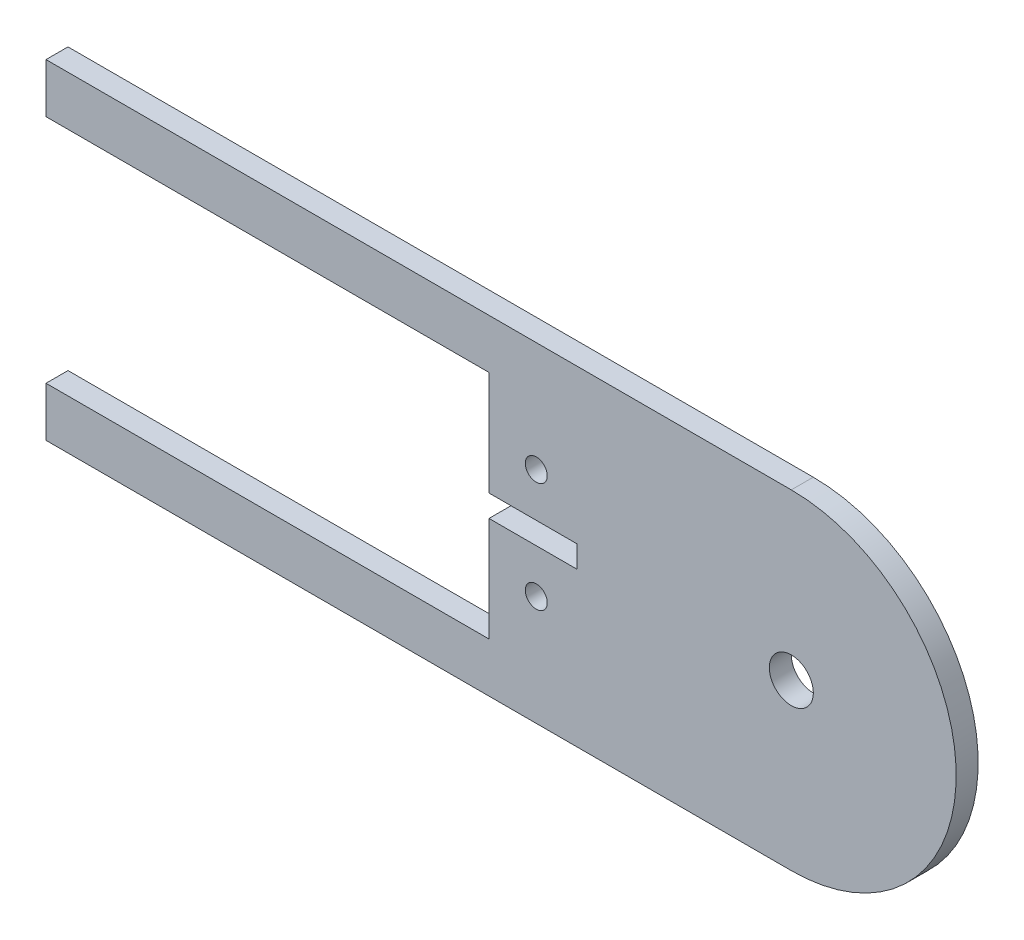
ISO-10303-21;
HEADER;
FILE_DESCRIPTION(('STEP AP214'),'2;1');
FILE_NAME('part.step','',(''),(''),'','','');
FILE_SCHEMA(('AUTOMOTIVE_DESIGN { 1 0 10303 214 1 1 1 1 }'));
ENDSEC;
DATA;
#1=APPLICATION_CONTEXT('core data for automotive mechanical design processes');
#2=APPLICATION_PROTOCOL_DEFINITION('international standard','automotive_design',2000,#1);
#3=PRODUCT_CONTEXT('',#1,'mechanical');
#4=PRODUCT('Part','Part','',(#3));
#5=PRODUCT_RELATED_PRODUCT_CATEGORY('part','',(#4));
#6=PRODUCT_DEFINITION_FORMATION('','',#4);
#7=PRODUCT_DEFINITION_CONTEXT('part definition',#1,'design');
#8=PRODUCT_DEFINITION('design','',#6,#7);
#9=PRODUCT_DEFINITION_SHAPE('','',#8);
#10=(LENGTH_UNIT() NAMED_UNIT(*) SI_UNIT(.MILLI.,.METRE.));
#11=(NAMED_UNIT(*) PLANE_ANGLE_UNIT() SI_UNIT($,.RADIAN.));
#12=(NAMED_UNIT(*) SI_UNIT($,.STERADIAN.) SOLID_ANGLE_UNIT());
#13=UNCERTAINTY_MEASURE_WITH_UNIT(LENGTH_MEASURE(1.E-05),#10,'distance_accuracy_value','');
#14=(GEOMETRIC_REPRESENTATION_CONTEXT(3) GLOBAL_UNCERTAINTY_ASSIGNED_CONTEXT((#13)) GLOBAL_UNIT_ASSIGNED_CONTEXT((#10,
#11,#12)) REPRESENTATION_CONTEXT('',''));
#15=CARTESIAN_POINT('',(0.,0.,0.));
#16=DIRECTION('',(0.,0.,1.));
#17=DIRECTION('',(1.,0.,0.));
#18=AXIS2_PLACEMENT_3D('',#15,#16,#17);
#19=CARTESIAN_POINT('',(0.,30.,-33.));
#20=DIRECTION('',(0.,0.,1.));
#21=DIRECTION('',(1.,0.,0.));
#22=AXIS2_PLACEMENT_3D('',#19,#20,#21);
#23=PLANE('',#22);
#24=CARTESIAN_POINT('',(77.8,15.,-33.));
#25=DIRECTION('',(0.,0.,1.));
#26=DIRECTION('',(1.,0.,0.));
#27=AXIS2_PLACEMENT_3D('',#24,#25,#26);
#28=CIRCLE('',#27,2.);
#29=CARTESIAN_POINT('',(79.8,15.,-33.));
#30=VERTEX_POINT('',#29);
#31=EDGE_CURVE('E181',#30,#30,#28,.T.);
#32=ORIENTED_EDGE('',*,*,#31,.T.);
#33=EDGE_LOOP('',(#32));
#34=FACE_BOUND('',#33,.T.);
#35=CARTESIAN_POINT('',(54.6,9.99999999999999,-33.));
#36=DIRECTION('',(0.,0.,-1.));
#37=DIRECTION('',(-1.,0.,0.));
#38=AXIS2_PLACEMENT_3D('',#35,#36,#37);
#39=CIRCLE('',#38,1.00000000000001);
#40=CARTESIAN_POINT('',(53.6,9.99999999999999,-33.));
#41=VERTEX_POINT('',#40);
#42=EDGE_CURVE('E176',#41,#41,#39,.T.);
#43=ORIENTED_EDGE('',*,*,#42,.F.);
#44=EDGE_LOOP('',(#43));
#45=FACE_BOUND('',#44,.T.);
#46=CARTESIAN_POINT('',(54.6,20.,-33.));
#47=DIRECTION('',(0.,0.,-1.));
#48=DIRECTION('',(-1.,0.,0.));
#49=AXIS2_PLACEMENT_3D('',#46,#47,#48);
#50=CIRCLE('',#49,0.999999999999998);
#51=CARTESIAN_POINT('',(53.6,20.,-33.));
#52=VERTEX_POINT('',#51);
#53=EDGE_CURVE('E255',#52,#52,#50,.T.);
#54=ORIENTED_EDGE('',*,*,#53,.F.);
#55=EDGE_LOOP('',(#54));
#56=FACE_BOUND('',#55,.T.);
#57=DIRECTION('',(-1.,0.,0.));
#58=VECTOR('',#57,1.);
#59=CARTESIAN_POINT('',(0.,30.,-33.));
#60=LINE('',#59,#58);
#61=CARTESIAN_POINT('',(77.8,30.,-33.));
#62=VERTEX_POINT('',#61);
#63=CARTESIAN_POINT('',(9.99999999999999,30.,-33.));
#64=VERTEX_POINT('',#63);
#65=EDGE_CURVE('E148',#62,#64,#60,.T.);
#66=ORIENTED_EDGE('',*,*,#65,.F.);
#67=CARTESIAN_POINT('',(77.8,15.,-33.));
#68=DIRECTION('',(0.,0.,1.));
#69=DIRECTION('',(-1.,0.,0.));
#70=AXIS2_PLACEMENT_3D('',#67,#68,#69);
#71=CIRCLE('',#70,15.);
#72=CARTESIAN_POINT('',(77.8,0.,-33.));
#73=VERTEX_POINT('',#72);
#74=EDGE_CURVE('E128',#73,#62,#71,.T.);
#75=ORIENTED_EDGE('',*,*,#74,.F.);
#76=DIRECTION('',(-1.,0.,0.));
#77=VECTOR('',#76,1.);
#78=CARTESIAN_POINT('',(0.,0.,-33.));
#79=LINE('',#78,#77);
#80=CARTESIAN_POINT('',(9.99999999999999,0.,-33.));
#81=VERTEX_POINT('',#80);
#82=EDGE_CURVE('E155',#73,#81,#79,.T.);
#83=ORIENTED_EDGE('',*,*,#82,.T.);
#84=DIRECTION('',(0.,-1.,0.));
#85=VECTOR('',#84,1.);
#86=CARTESIAN_POINT('',(9.99999999999999,30.,-33.));
#87=LINE('',#86,#85);
#88=CARTESIAN_POINT('',(10.,4.5,-33.));
#89=VERTEX_POINT('',#88);
#90=EDGE_CURVE('E46',#89,#81,#87,.T.);
#91=ORIENTED_EDGE('',*,*,#90,.F.);
#92=DIRECTION('',(1.,0.,0.));
#93=VECTOR('',#92,1.);
#94=CARTESIAN_POINT('',(0.,4.5,-33.));
#95=LINE('',#94,#93);
#96=CARTESIAN_POINT('',(50.3,4.5,-33.));
#97=VERTEX_POINT('',#96);
#98=EDGE_CURVE('E157',#89,#97,#95,.T.);
#99=ORIENTED_EDGE('',*,*,#98,.T.);
#100=DIRECTION('',(0.,1.,0.));
#101=VECTOR('',#100,1.);
#102=CARTESIAN_POINT('',(50.3,30.,-33.));
#103=LINE('',#102,#101);
#104=CARTESIAN_POINT('',(50.3,14.,-33.));
#105=VERTEX_POINT('',#104);
#106=EDGE_CURVE('E202',#97,#105,#103,.T.);
#107=ORIENTED_EDGE('',*,*,#106,.T.);
#108=DIRECTION('',(1.,0.,0.));
#109=VECTOR('',#108,1.);
#110=CARTESIAN_POINT('',(0.,14.,-33.));
#111=LINE('',#110,#109);
#112=CARTESIAN_POINT('',(58.3,14.,-33.));
#113=VERTEX_POINT('',#112);
#114=EDGE_CURVE('E225',#105,#113,#111,.T.);
#115=ORIENTED_EDGE('',*,*,#114,.T.);
#116=DIRECTION('',(0.,1.,0.));
#117=VECTOR('',#116,1.);
#118=CARTESIAN_POINT('',(58.3,30.,-33.));
#119=LINE('',#118,#117);
#120=CARTESIAN_POINT('',(58.3,16.,-33.));
#121=VERTEX_POINT('',#120);
#122=EDGE_CURVE('E228',#113,#121,#119,.T.);
#123=ORIENTED_EDGE('',*,*,#122,.T.);
#124=DIRECTION('',(-1.,0.,0.));
#125=VECTOR('',#124,1.);
#126=CARTESIAN_POINT('',(0.,16.,-33.));
#127=LINE('',#126,#125);
#128=CARTESIAN_POINT('',(50.3,16.,-33.));
#129=VERTEX_POINT('',#128);
#130=EDGE_CURVE('E226',#121,#129,#127,.T.);
#131=ORIENTED_EDGE('',*,*,#130,.T.);
#132=CARTESIAN_POINT('',(50.3,25.5,-33.));
#133=VERTEX_POINT('',#132);
#134=EDGE_CURVE('E197',#129,#133,#103,.T.);
#135=ORIENTED_EDGE('',*,*,#134,.T.);
#136=DIRECTION('',(-1.,0.,0.));
#137=VECTOR('',#136,1.);
#138=CARTESIAN_POINT('',(0.,25.5,-33.));
#139=LINE('',#138,#137);
#140=CARTESIAN_POINT('',(9.99999999999999,25.5,-33.));
#141=VERTEX_POINT('',#140);
#142=EDGE_CURVE('E194',#133,#141,#139,.T.);
#143=ORIENTED_EDGE('',*,*,#142,.T.);
#144=EDGE_CURVE('E161',#64,#141,#87,.T.);
#145=ORIENTED_EDGE('',*,*,#144,.F.);
#146=EDGE_LOOP('',(#66,#75,#83,#91,#99,#107,#115,#123,#131,#135,#143,#145));
#147=FACE_BOUND('',#146,.T.);
#148=ADVANCED_FACE('F37',(#34,#45,#56,#147),#23,.F.);
#149=CARTESIAN_POINT('',(0.,30.,-31.));
#150=DIRECTION('',(0.,0.,-1.));
#151=DIRECTION('',(-1.,0.,0.));
#152=AXIS2_PLACEMENT_3D('',#149,#150,#151);
#153=PLANE('',#152);
#154=CARTESIAN_POINT('',(77.8,15.,-31.));
#155=DIRECTION('',(0.,0.,-1.));
#156=DIRECTION('',(-1.,0.,0.));
#157=AXIS2_PLACEMENT_3D('',#154,#155,#156);
#158=CIRCLE('',#157,2.);
#159=CARTESIAN_POINT('',(75.8,15.,-31.));
#160=VERTEX_POINT('',#159);
#161=EDGE_CURVE('E132',#160,#160,#158,.T.);
#162=ORIENTED_EDGE('',*,*,#161,.T.);
#163=EDGE_LOOP('',(#162));
#164=FACE_BOUND('',#163,.T.);
#165=CARTESIAN_POINT('',(54.6,9.99999999999999,-31.));
#166=DIRECTION('',(0.,0.,-1.));
#167=DIRECTION('',(-1.,0.,0.));
#168=AXIS2_PLACEMENT_3D('',#165,#166,#167);
#169=CIRCLE('',#168,1.00000000000001);
#170=CARTESIAN_POINT('',(53.6,9.99999999999999,-31.));
#171=VERTEX_POINT('',#170);
#172=EDGE_CURVE('E175',#171,#171,#169,.T.);
#173=ORIENTED_EDGE('',*,*,#172,.T.);
#174=EDGE_LOOP('',(#173));
#175=FACE_BOUND('',#174,.T.);
#176=CARTESIAN_POINT('',(54.6,20.,-31.));
#177=DIRECTION('',(0.,0.,-1.));
#178=DIRECTION('',(-1.,0.,0.));
#179=AXIS2_PLACEMENT_3D('',#176,#177,#178);
#180=CIRCLE('',#179,0.999999999999998);
#181=CARTESIAN_POINT('',(53.6,20.,-31.));
#182=VERTEX_POINT('',#181);
#183=EDGE_CURVE('E172',#182,#182,#180,.T.);
#184=ORIENTED_EDGE('',*,*,#183,.T.);
#185=EDGE_LOOP('',(#184));
#186=FACE_BOUND('',#185,.T.);
#187=DIRECTION('',(1.,0.,0.));
#188=VECTOR('',#187,1.);
#189=CARTESIAN_POINT('',(0.,0.,-31.));
#190=LINE('',#189,#188);
#191=CARTESIAN_POINT('',(10.,0.,-31.));
#192=VERTEX_POINT('',#191);
#193=CARTESIAN_POINT('',(77.8,0.,-31.));
#194=VERTEX_POINT('',#193);
#195=EDGE_CURVE('E142',#192,#194,#190,.T.);
#196=ORIENTED_EDGE('',*,*,#195,.T.);
#197=CARTESIAN_POINT('',(77.8,15.,-31.));
#198=DIRECTION('',(0.,0.,1.));
#199=DIRECTION('',(-1.,0.,0.));
#200=AXIS2_PLACEMENT_3D('',#197,#198,#199);
#201=CIRCLE('',#200,15.);
#202=CARTESIAN_POINT('',(77.8,30.,-31.));
#203=VERTEX_POINT('',#202);
#204=EDGE_CURVE('E54',#194,#203,#201,.T.);
#205=ORIENTED_EDGE('',*,*,#204,.T.);
#206=DIRECTION('',(1.,0.,0.));
#207=VECTOR('',#206,1.);
#208=CARTESIAN_POINT('',(0.,30.,-31.));
#209=LINE('',#208,#207);
#210=CARTESIAN_POINT('',(10.,30.,-31.));
#211=VERTEX_POINT('',#210);
#212=EDGE_CURVE('E139',#211,#203,#209,.T.);
#213=ORIENTED_EDGE('',*,*,#212,.F.);
#214=DIRECTION('',(0.,-1.,0.));
#215=VECTOR('',#214,1.);
#216=CARTESIAN_POINT('',(10.,30.,-31.));
#217=LINE('',#216,#215);
#218=CARTESIAN_POINT('',(10.,25.5,-31.));
#219=VERTEX_POINT('',#218);
#220=EDGE_CURVE('E150',#211,#219,#217,.T.);
#221=ORIENTED_EDGE('',*,*,#220,.T.);
#222=DIRECTION('',(1.,0.,0.));
#223=VECTOR('',#222,1.);
#224=CARTESIAN_POINT('',(0.,25.5,-31.));
#225=LINE('',#224,#223);
#226=CARTESIAN_POINT('',(50.3,25.5,-31.));
#227=VERTEX_POINT('',#226);
#228=EDGE_CURVE('E159',#219,#227,#225,.T.);
#229=ORIENTED_EDGE('',*,*,#228,.T.);
#230=DIRECTION('',(0.,-1.,0.));
#231=VECTOR('',#230,1.);
#232=CARTESIAN_POINT('',(50.3,30.,-31.));
#233=LINE('',#232,#231);
#234=CARTESIAN_POINT('',(50.3,16.,-31.));
#235=VERTEX_POINT('',#234);
#236=EDGE_CURVE('E165',#227,#235,#233,.T.);
#237=ORIENTED_EDGE('',*,*,#236,.T.);
#238=DIRECTION('',(1.,0.,0.));
#239=VECTOR('',#238,1.);
#240=CARTESIAN_POINT('',(58.3,16.,-31.));
#241=LINE('',#240,#239);
#242=CARTESIAN_POINT('',(58.3,16.,-31.));
#243=VERTEX_POINT('',#242);
#244=EDGE_CURVE('E179',#235,#243,#241,.T.);
#245=ORIENTED_EDGE('',*,*,#244,.T.);
#246=DIRECTION('',(0.,-1.,0.));
#247=VECTOR('',#246,1.);
#248=CARTESIAN_POINT('',(58.3,14.,-31.));
#249=LINE('',#248,#247);
#250=CARTESIAN_POINT('',(58.3,14.,-31.));
#251=VERTEX_POINT('',#250);
#252=EDGE_CURVE('E252',#243,#251,#249,.T.);
#253=ORIENTED_EDGE('',*,*,#252,.T.);
#254=DIRECTION('',(-1.,0.,0.));
#255=VECTOR('',#254,1.);
#256=CARTESIAN_POINT('',(58.3,14.,-31.));
#257=LINE('',#256,#255);
#258=CARTESIAN_POINT('',(50.3,14.,-31.));
#259=VERTEX_POINT('',#258);
#260=EDGE_CURVE('E249',#251,#259,#257,.T.);
#261=ORIENTED_EDGE('',*,*,#260,.T.);
#262=CARTESIAN_POINT('',(50.3,4.5,-31.));
#263=VERTEX_POINT('',#262);
#264=EDGE_CURVE('E164',#259,#263,#233,.T.);
#265=ORIENTED_EDGE('',*,*,#264,.T.);
#266=DIRECTION('',(-1.,0.,0.));
#267=VECTOR('',#266,1.);
#268=CARTESIAN_POINT('',(0.,4.5,-31.));
#269=LINE('',#268,#267);
#270=CARTESIAN_POINT('',(10.,4.5,-31.));
#271=VERTEX_POINT('',#270);
#272=EDGE_CURVE('E168',#263,#271,#269,.T.);
#273=ORIENTED_EDGE('',*,*,#272,.T.);
#274=EDGE_CURVE('E147',#271,#192,#217,.T.);
#275=ORIENTED_EDGE('',*,*,#274,.T.);
#276=EDGE_LOOP('',(#196,#205,#213,#221,#229,#237,#245,#253,#261,#265,#273,#275));
#277=FACE_BOUND('',#276,.T.);
#278=ADVANCED_FACE('F138',(#164,#175,#186,#277),#153,.F.);
#279=CARTESIAN_POINT('',(10.,14.,-33.));
#280=DIRECTION('',(1.,0.,0.));
#281=DIRECTION('',(0.,0.,-1.));
#282=AXIS2_PLACEMENT_3D('',#279,#280,#281);
#283=PLANE('',#282);
#284=ORIENTED_EDGE('',*,*,#274,.F.);
#285=DIRECTION('',(0.,0.,-1.));
#286=VECTOR('',#285,1.);
#287=CARTESIAN_POINT('',(10.,4.5,0.));
#288=LINE('',#287,#286);
#289=EDGE_CURVE('E11',#271,#89,#288,.T.);
#290=ORIENTED_EDGE('',*,*,#289,.T.);
#291=ORIENTED_EDGE('',*,*,#90,.T.);
#292=DIRECTION('',(0.,0.,-1.));
#293=VECTOR('',#292,1.);
#294=CARTESIAN_POINT('',(10.,0.,0.));
#295=LINE('',#294,#293);
#296=EDGE_CURVE('E171',#192,#81,#295,.T.);
#297=ORIENTED_EDGE('',*,*,#296,.F.);
#298=EDGE_LOOP('',(#284,#290,#291,#297));
#299=FACE_BOUND('',#298,.T.);
#300=ADVANCED_FACE('F39',(#299),#283,.F.);
#301=DIRECTION('',(0.,0.,-1.));
#302=VECTOR('',#301,1.);
#303=CARTESIAN_POINT('',(10.,30.,0.));
#304=LINE('',#303,#302);
#305=EDGE_CURVE('E41',#211,#64,#304,.T.);
#306=ORIENTED_EDGE('',*,*,#305,.T.);
#307=ORIENTED_EDGE('',*,*,#144,.T.);
#308=DIRECTION('',(0.,0.,-1.));
#309=VECTOR('',#308,1.);
#310=CARTESIAN_POINT('',(10.,25.5,0.));
#311=LINE('',#310,#309);
#312=EDGE_CURVE('E191',#219,#141,#311,.T.);
#313=ORIENTED_EDGE('',*,*,#312,.F.);
#314=ORIENTED_EDGE('',*,*,#220,.F.);
#315=EDGE_LOOP('',(#306,#307,#313,#314));
#316=FACE_BOUND('',#315,.T.);
#317=ADVANCED_FACE('F190',(#316),#283,.F.);
#318=CARTESIAN_POINT('',(50.3,25.5,0.));
#319=DIRECTION('',(1.,0.,0.));
#320=DIRECTION('',(0.,0.,-1.));
#321=AXIS2_PLACEMENT_3D('',#318,#319,#320);
#322=PLANE('',#321);
#323=ORIENTED_EDGE('',*,*,#264,.F.);
#324=DIRECTION('',(0.,0.,-1.));
#325=VECTOR('',#324,1.);
#326=CARTESIAN_POINT('',(50.3,14.,0.));
#327=LINE('',#326,#325);
#328=EDGE_CURVE('E221',#259,#105,#327,.T.);
#329=ORIENTED_EDGE('',*,*,#328,.T.);
#330=ORIENTED_EDGE('',*,*,#106,.F.);
#331=DIRECTION('',(0.,0.,-1.));
#332=VECTOR('',#331,1.);
#333=CARTESIAN_POINT('',(50.3,4.5,0.));
#334=LINE('',#333,#332);
#335=EDGE_CURVE('E200',#263,#97,#334,.T.);
#336=ORIENTED_EDGE('',*,*,#335,.F.);
#337=EDGE_LOOP('',(#323,#329,#330,#336));
#338=FACE_BOUND('',#337,.T.);
#339=ADVANCED_FACE('F219',(#338),#322,.F.);
#340=CARTESIAN_POINT('',(0.,30.,0.));
#341=DIRECTION('',(0.,1.,0.));
#342=DIRECTION('',(0.,0.,1.));
#343=AXIS2_PLACEMENT_3D('',#340,#341,#342);
#344=PLANE('',#343);
#345=DIRECTION('',(0.,0.,-1.));
#346=VECTOR('',#345,1.);
#347=CARTESIAN_POINT('',(77.8,30.,-31.));
#348=LINE('',#347,#346);
#349=EDGE_CURVE('E125',#203,#62,#348,.T.);
#350=ORIENTED_EDGE('',*,*,#349,.T.);
#351=ORIENTED_EDGE('',*,*,#65,.T.);
#352=ORIENTED_EDGE('',*,*,#305,.F.);
#353=ORIENTED_EDGE('',*,*,#212,.T.);
#354=EDGE_LOOP('',(#350,#351,#352,#353));
#355=FACE_BOUND('',#354,.T.);
#356=ADVANCED_FACE('F145',(#355),#344,.T.);
#357=CARTESIAN_POINT('',(0.,0.,0.));
#358=DIRECTION('',(0.,1.,0.));
#359=DIRECTION('',(0.,0.,1.));
#360=AXIS2_PLACEMENT_3D('',#357,#358,#359);
#361=PLANE('',#360);
#362=ORIENTED_EDGE('',*,*,#82,.F.);
#363=DIRECTION('',(0.,0.,-1.));
#364=VECTOR('',#363,1.);
#365=CARTESIAN_POINT('',(77.8,0.,-31.));
#366=LINE('',#365,#364);
#367=EDGE_CURVE('E133',#194,#73,#366,.T.);
#368=ORIENTED_EDGE('',*,*,#367,.F.);
#369=ORIENTED_EDGE('',*,*,#195,.F.);
#370=ORIENTED_EDGE('',*,*,#296,.T.);
#371=EDGE_LOOP('',(#362,#368,#369,#370));
#372=FACE_BOUND('',#371,.T.);
#373=ADVANCED_FACE('F263',(#372),#361,.F.);
#374=CARTESIAN_POINT('',(10.,4.5,0.));
#375=DIRECTION('',(0.,-1.,0.));
#376=DIRECTION('',(0.,0.,-1.));
#377=AXIS2_PLACEMENT_3D('',#374,#375,#376);
#378=PLANE('',#377);
#379=ORIENTED_EDGE('',*,*,#289,.F.);
#380=ORIENTED_EDGE('',*,*,#272,.F.);
#381=ORIENTED_EDGE('',*,*,#335,.T.);
#382=ORIENTED_EDGE('',*,*,#98,.F.);
#383=EDGE_LOOP('',(#379,#380,#381,#382));
#384=FACE_BOUND('',#383,.T.);
#385=ADVANCED_FACE('F213',(#384),#378,.F.);
#386=ORIENTED_EDGE('',*,*,#134,.F.);
#387=DIRECTION('',(0.,0.,1.));
#388=VECTOR('',#387,1.);
#389=CARTESIAN_POINT('',(50.3,16.,0.));
#390=LINE('',#389,#388);
#391=EDGE_CURVE('E230',#129,#235,#390,.T.);
#392=ORIENTED_EDGE('',*,*,#391,.T.);
#393=ORIENTED_EDGE('',*,*,#236,.F.);
#394=DIRECTION('',(0.,0.,-1.));
#395=VECTOR('',#394,1.);
#396=CARTESIAN_POINT('',(50.3,25.5,0.));
#397=LINE('',#396,#395);
#398=EDGE_CURVE('E205',#227,#133,#397,.T.);
#399=ORIENTED_EDGE('',*,*,#398,.T.);
#400=EDGE_LOOP('',(#386,#392,#393,#399));
#401=FACE_BOUND('',#400,.T.);
#402=ADVANCED_FACE('F241',(#401),#322,.F.);
#403=CARTESIAN_POINT('',(10.,25.5,0.));
#404=DIRECTION('',(0.,1.,0.));
#405=DIRECTION('',(0.,0.,1.));
#406=AXIS2_PLACEMENT_3D('',#403,#404,#405);
#407=PLANE('',#406);
#408=ORIENTED_EDGE('',*,*,#398,.F.);
#409=ORIENTED_EDGE('',*,*,#228,.F.);
#410=ORIENTED_EDGE('',*,*,#312,.T.);
#411=ORIENTED_EDGE('',*,*,#142,.F.);
#412=EDGE_LOOP('',(#408,#409,#410,#411));
#413=FACE_BOUND('',#412,.T.);
#414=ADVANCED_FACE('F237',(#413),#407,.F.);
#415=CARTESIAN_POINT('',(58.3,14.,-31.));
#416=DIRECTION('',(1.,0.,0.));
#417=DIRECTION('',(0.,0.,-1.));
#418=AXIS2_PLACEMENT_3D('',#415,#416,#417);
#419=PLANE('',#418);
#420=DIRECTION('',(0.,0.,-1.));
#421=VECTOR('',#420,1.);
#422=CARTESIAN_POINT('',(58.3,14.,-31.));
#423=LINE('',#422,#421);
#424=EDGE_CURVE('E243',#251,#113,#423,.T.);
#425=ORIENTED_EDGE('',*,*,#424,.F.);
#426=ORIENTED_EDGE('',*,*,#252,.F.);
#427=DIRECTION('',(0.,0.,-1.));
#428=VECTOR('',#427,1.);
#429=CARTESIAN_POINT('',(58.3,16.,-31.));
#430=LINE('',#429,#428);
#431=EDGE_CURVE('E245',#243,#121,#430,.T.);
#432=ORIENTED_EDGE('',*,*,#431,.T.);
#433=ORIENTED_EDGE('',*,*,#122,.F.);
#434=EDGE_LOOP('',(#425,#426,#432,#433));
#435=FACE_BOUND('',#434,.T.);
#436=ADVANCED_FACE('F306',(#435),#419,.F.);
#437=CARTESIAN_POINT('',(58.3,14.,-31.));
#438=DIRECTION('',(0.,-1.,0.));
#439=DIRECTION('',(1.,0.,0.));
#440=AXIS2_PLACEMENT_3D('',#437,#438,#439);
#441=PLANE('',#440);
#442=ORIENTED_EDGE('',*,*,#328,.F.);
#443=ORIENTED_EDGE('',*,*,#260,.F.);
#444=ORIENTED_EDGE('',*,*,#424,.T.);
#445=ORIENTED_EDGE('',*,*,#114,.F.);
#446=EDGE_LOOP('',(#442,#443,#444,#445));
#447=FACE_BOUND('',#446,.T.);
#448=ADVANCED_FACE('F300',(#447),#441,.F.);
#449=CARTESIAN_POINT('',(58.3,16.,-31.));
#450=DIRECTION('',(0.,1.,0.));
#451=DIRECTION('',(-1.,0.,0.));
#452=AXIS2_PLACEMENT_3D('',#449,#450,#451);
#453=PLANE('',#452);
#454=ORIENTED_EDGE('',*,*,#431,.F.);
#455=ORIENTED_EDGE('',*,*,#244,.F.);
#456=ORIENTED_EDGE('',*,*,#391,.F.);
#457=ORIENTED_EDGE('',*,*,#130,.F.);
#458=EDGE_LOOP('',(#454,#455,#456,#457));
#459=FACE_BOUND('',#458,.T.);
#460=ADVANCED_FACE('F289',(#459),#453,.F.);
#461=CARTESIAN_POINT('',(54.6,20.,-29.));
#462=DIRECTION('',(0.,0.,-1.));
#463=DIRECTION('',(-1.,0.,0.));
#464=AXIS2_PLACEMENT_3D('',#461,#462,#463);
#465=CYLINDRICAL_SURFACE('',#464,0.999999999999998);
#466=ORIENTED_EDGE('',*,*,#53,.T.);
#467=EDGE_LOOP('',(#466));
#468=FACE_BOUND('',#467,.T.);
#469=ORIENTED_EDGE('',*,*,#183,.F.);
#470=EDGE_LOOP('',(#469));
#471=FACE_BOUND('',#470,.T.);
#472=ADVANCED_FACE('F285',(#468,#471),#465,.F.);
#473=CARTESIAN_POINT('',(54.6,9.99999999999999,-29.));
#474=DIRECTION('',(0.,0.,-1.));
#475=DIRECTION('',(-1.,0.,0.));
#476=AXIS2_PLACEMENT_3D('',#473,#474,#475);
#477=CYLINDRICAL_SURFACE('',#476,1.00000000000001);
#478=ORIENTED_EDGE('',*,*,#42,.T.);
#479=EDGE_LOOP('',(#478));
#480=FACE_BOUND('',#479,.T.);
#481=ORIENTED_EDGE('',*,*,#172,.F.);
#482=EDGE_LOOP('',(#481));
#483=FACE_BOUND('',#482,.T.);
#484=ADVANCED_FACE('F288',(#480,#483),#477,.F.);
#485=CARTESIAN_POINT('',(77.8,15.,0.));
#486=DIRECTION('',(0.,0.,-1.));
#487=DIRECTION('',(-1.,0.,0.));
#488=AXIS2_PLACEMENT_3D('',#485,#486,#487);
#489=CYLINDRICAL_SURFACE('',#488,2.);
#490=ORIENTED_EDGE('',*,*,#161,.F.);
#491=EDGE_LOOP('',(#490));
#492=FACE_BOUND('',#491,.T.);
#493=ORIENTED_EDGE('',*,*,#31,.F.);
#494=EDGE_LOOP('',(#493));
#495=FACE_BOUND('',#494,.T.);
#496=ADVANCED_FACE('F297',(#492,#495),#489,.F.);
#497=CARTESIAN_POINT('',(77.8,15.,-31.));
#498=DIRECTION('',(0.,0.,-1.));
#499=DIRECTION('',(-1.,0.,0.));
#500=AXIS2_PLACEMENT_3D('',#497,#498,#499);
#501=CYLINDRICAL_SURFACE('',#500,15.);
#502=ORIENTED_EDGE('',*,*,#74,.T.);
#503=ORIENTED_EDGE('',*,*,#349,.F.);
#504=ORIENTED_EDGE('',*,*,#204,.F.);
#505=ORIENTED_EDGE('',*,*,#367,.T.);
#506=EDGE_LOOP('',(#502,#503,#504,#505));
#507=FACE_BOUND('',#506,.T.);
#508=ADVANCED_FACE('F126',(#507),#501,.T.);
#509=CLOSED_SHELL('',(#148,#278,#300,#317,#339,#356,#373,#385,#402,#414,#436,#448,#460,#472,
#484,#496,#508));
#510=MANIFOLD_SOLID_BREP('B2',#509);
#511=ADVANCED_BREP_SHAPE_REPRESENTATION('',(#18,#510),#14);
#512=SHAPE_DEFINITION_REPRESENTATION(#9,#511);
ENDSEC;
END-ISO-10303-21;
